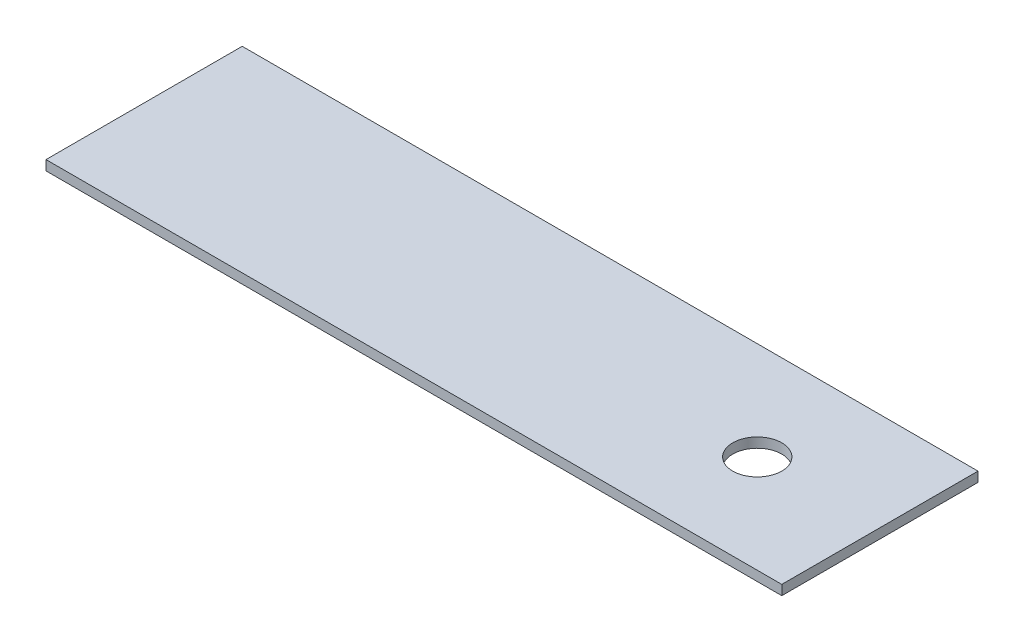
ISO-10303-21;
HEADER;
FILE_DESCRIPTION(('STEP AP214'),'2;1');
FILE_NAME('part.step','',(''),(''),'','','');
FILE_SCHEMA(('AUTOMOTIVE_DESIGN { 1 0 10303 214 1 1 1 1 }'));
ENDSEC;
DATA;
#1=APPLICATION_CONTEXT('core data for automotive mechanical design processes');
#2=APPLICATION_PROTOCOL_DEFINITION('international standard','automotive_design',2000,#1);
#3=PRODUCT_CONTEXT('',#1,'mechanical');
#4=PRODUCT('Part','Part','',(#3));
#5=PRODUCT_RELATED_PRODUCT_CATEGORY('part','',(#4));
#6=PRODUCT_DEFINITION_FORMATION('','',#4);
#7=PRODUCT_DEFINITION_CONTEXT('part definition',#1,'design');
#8=PRODUCT_DEFINITION('design','',#6,#7);
#9=PRODUCT_DEFINITION_SHAPE('','',#8);
#10=(LENGTH_UNIT() NAMED_UNIT(*) SI_UNIT(.MILLI.,.METRE.));
#11=(NAMED_UNIT(*) PLANE_ANGLE_UNIT() SI_UNIT($,.RADIAN.));
#12=(NAMED_UNIT(*) SI_UNIT($,.STERADIAN.) SOLID_ANGLE_UNIT());
#13=UNCERTAINTY_MEASURE_WITH_UNIT(LENGTH_MEASURE(1.E-05),#10,'distance_accuracy_value','');
#14=(GEOMETRIC_REPRESENTATION_CONTEXT(3) GLOBAL_UNCERTAINTY_ASSIGNED_CONTEXT((#13)) GLOBAL_UNIT_ASSIGNED_CONTEXT((#10,
#11,#12)) REPRESENTATION_CONTEXT('',''));
#15=CARTESIAN_POINT('',(0.,0.,0.));
#16=DIRECTION('',(0.,0.,1.));
#17=DIRECTION('',(1.,0.,0.));
#18=AXIS2_PLACEMENT_3D('',#15,#16,#17);
#19=CARTESIAN_POINT('',(0.,2.,0.));
#20=DIRECTION('',(0.,1.,0.));
#21=DIRECTION('',(0.,0.,1.));
#22=AXIS2_PLACEMENT_3D('',#19,#20,#21);
#23=PLANE('',#22);
#24=DIRECTION('',(0.,0.,1.));
#25=VECTOR('',#24,1.);
#26=CARTESIAN_POINT('',(-33.2855548608348,2.,-10.179562894333));
#27=LINE('',#26,#25);
#28=CARTESIAN_POINT('',(-33.2855548608348,2.,-10.179562894333));
#29=VERTEX_POINT('',#28);
#30=CARTESIAN_POINT('',(-33.2855548608348,2.,29.820437105667));
#31=VERTEX_POINT('',#30);
#32=EDGE_CURVE('E87',#29,#31,#27,.T.);
#33=ORIENTED_EDGE('',*,*,#32,.T.);
#34=DIRECTION('',(1.,0.,0.));
#35=VECTOR('',#34,1.);
#36=CARTESIAN_POINT('',(-33.2855548608348,2.,29.820437105667));
#37=LINE('',#36,#35);
#38=CARTESIAN_POINT('',(116.714445139165,2.,29.820437105667));
#39=VERTEX_POINT('',#38);
#40=EDGE_CURVE('E82',#31,#39,#37,.T.);
#41=ORIENTED_EDGE('',*,*,#40,.T.);
#42=DIRECTION('',(0.,0.,-1.));
#43=VECTOR('',#42,1.);
#44=CARTESIAN_POINT('',(116.714445139165,2.,-10.179562894333));
#45=LINE('',#44,#43);
#46=CARTESIAN_POINT('',(116.714445139165,2.,-10.179562894333));
#47=VERTEX_POINT('',#46);
#48=EDGE_CURVE('E85',#39,#47,#45,.T.);
#49=ORIENTED_EDGE('',*,*,#48,.T.);
#50=DIRECTION('',(-1.,0.,0.));
#51=VECTOR('',#50,1.);
#52=CARTESIAN_POINT('',(-33.2855548608348,2.,-10.179562894333));
#53=LINE('',#52,#51);
#54=EDGE_CURVE('E52',#47,#29,#53,.T.);
#55=ORIENTED_EDGE('',*,*,#54,.T.);
#56=EDGE_LOOP('',(#33,#41,#49,#55));
#57=FACE_BOUND('',#56,.T.);
#58=CARTESIAN_POINT('',(91.7144451391652,2.,9.82043710566703));
#59=DIRECTION('',(0.,1.,0.));
#60=DIRECTION('',(0.,0.,1.));
#61=AXIS2_PLACEMENT_3D('',#58,#59,#60);
#62=CIRCLE('',#61,5.);
#63=CARTESIAN_POINT('',(91.7144451391652,2.,14.820437105667));
#64=VERTEX_POINT('',#63);
#65=EDGE_CURVE('E102',#64,#64,#62,.T.);
#66=ORIENTED_EDGE('',*,*,#65,.F.);
#67=EDGE_LOOP('',(#66));
#68=FACE_BOUND('',#67,.T.);
#69=ADVANCED_FACE('F35',(#57,#68),#23,.T.);
#70=CARTESIAN_POINT('',(0.,0.,0.));
#71=DIRECTION('',(0.,1.,0.));
#72=DIRECTION('',(0.,0.,1.));
#73=AXIS2_PLACEMENT_3D('',#70,#71,#72);
#74=PLANE('',#73);
#75=DIRECTION('',(0.,0.,1.));
#76=VECTOR('',#75,1.);
#77=CARTESIAN_POINT('',(-33.2855548608348,0.,-10.179562894333));
#78=LINE('',#77,#76);
#79=CARTESIAN_POINT('',(-33.2855548608348,0.,-10.179562894333));
#80=VERTEX_POINT('',#79);
#81=CARTESIAN_POINT('',(-33.2855548608348,0.,29.820437105667));
#82=VERTEX_POINT('',#81);
#83=EDGE_CURVE('E99',#80,#82,#78,.T.);
#84=ORIENTED_EDGE('',*,*,#83,.F.);
#85=DIRECTION('',(-1.,0.,0.));
#86=VECTOR('',#85,1.);
#87=CARTESIAN_POINT('',(-33.2855548608348,0.,-10.179562894333));
#88=LINE('',#87,#86);
#89=CARTESIAN_POINT('',(116.714445139165,0.,-10.179562894333));
#90=VERTEX_POINT('',#89);
#91=EDGE_CURVE('E75',#90,#80,#88,.T.);
#92=ORIENTED_EDGE('',*,*,#91,.F.);
#93=DIRECTION('',(0.,0.,-1.));
#94=VECTOR('',#93,1.);
#95=CARTESIAN_POINT('',(116.714445139165,0.,-10.179562894333));
#96=LINE('',#95,#94);
#97=CARTESIAN_POINT('',(116.714445139165,0.,29.820437105667));
#98=VERTEX_POINT('',#97);
#99=EDGE_CURVE('E69',#98,#90,#96,.T.);
#100=ORIENTED_EDGE('',*,*,#99,.F.);
#101=DIRECTION('',(1.,0.,0.));
#102=VECTOR('',#101,1.);
#103=CARTESIAN_POINT('',(-33.2855548608348,0.,29.820437105667));
#104=LINE('',#103,#102);
#105=EDGE_CURVE('E91',#82,#98,#104,.T.);
#106=ORIENTED_EDGE('',*,*,#105,.F.);
#107=EDGE_LOOP('',(#84,#92,#100,#106));
#108=FACE_BOUND('',#107,.T.);
#109=CARTESIAN_POINT('',(91.7144451391652,0.,9.82043710566703));
#110=DIRECTION('',(0.,1.,0.));
#111=DIRECTION('',(0.,0.,1.));
#112=AXIS2_PLACEMENT_3D('',#109,#110,#111);
#113=CIRCLE('',#112,5.);
#114=CARTESIAN_POINT('',(91.7144451391652,0.,14.820437105667));
#115=VERTEX_POINT('',#114);
#116=EDGE_CURVE('E114',#115,#115,#113,.T.);
#117=ORIENTED_EDGE('',*,*,#116,.T.);
#118=EDGE_LOOP('',(#117));
#119=FACE_BOUND('',#118,.T.);
#120=ADVANCED_FACE('F110',(#108,#119),#74,.F.);
#121=CARTESIAN_POINT('',(-33.2855548608348,2.,-10.179562894333));
#122=DIRECTION('',(1.,0.,0.));
#123=DIRECTION('',(0.,0.,-1.));
#124=AXIS2_PLACEMENT_3D('',#121,#122,#123);
#125=PLANE('',#124);
#126=ORIENTED_EDGE('',*,*,#83,.T.);
#127=DIRECTION('',(0.,-1.,0.));
#128=VECTOR('',#127,1.);
#129=CARTESIAN_POINT('',(-33.2855548608348,2.,29.820437105667));
#130=LINE('',#129,#128);
#131=EDGE_CURVE('E11',#31,#82,#130,.T.);
#132=ORIENTED_EDGE('',*,*,#131,.F.);
#133=ORIENTED_EDGE('',*,*,#32,.F.);
#134=DIRECTION('',(0.,-1.,0.));
#135=VECTOR('',#134,1.);
#136=CARTESIAN_POINT('',(-33.2855548608348,2.,-10.179562894333));
#137=LINE('',#136,#135);
#138=EDGE_CURVE('E95',#29,#80,#137,.T.);
#139=ORIENTED_EDGE('',*,*,#138,.T.);
#140=EDGE_LOOP('',(#126,#132,#133,#139));
#141=FACE_BOUND('',#140,.T.);
#142=ADVANCED_FACE('F37',(#141),#125,.F.);
#143=CARTESIAN_POINT('',(-33.2855548608348,2.,29.820437105667));
#144=DIRECTION('',(0.,0.,-1.));
#145=DIRECTION('',(-1.,0.,0.));
#146=AXIS2_PLACEMENT_3D('',#143,#144,#145);
#147=PLANE('',#146);
#148=ORIENTED_EDGE('',*,*,#105,.T.);
#149=DIRECTION('',(0.,-1.,0.));
#150=VECTOR('',#149,1.);
#151=CARTESIAN_POINT('',(116.714445139165,2.,29.820437105667));
#152=LINE('',#151,#150);
#153=EDGE_CURVE('E44',#39,#98,#152,.T.);
#154=ORIENTED_EDGE('',*,*,#153,.F.);
#155=ORIENTED_EDGE('',*,*,#40,.F.);
#156=ORIENTED_EDGE('',*,*,#131,.T.);
#157=EDGE_LOOP('',(#148,#154,#155,#156));
#158=FACE_BOUND('',#157,.T.);
#159=ADVANCED_FACE('F90',(#158),#147,.F.);
#160=CARTESIAN_POINT('',(116.714445139165,2.,-10.179562894333));
#161=DIRECTION('',(-1.,0.,0.));
#162=DIRECTION('',(0.,0.,1.));
#163=AXIS2_PLACEMENT_3D('',#160,#161,#162);
#164=PLANE('',#163);
#165=ORIENTED_EDGE('',*,*,#99,.T.);
#166=DIRECTION('',(0.,-1.,0.));
#167=VECTOR('',#166,1.);
#168=CARTESIAN_POINT('',(116.714445139165,2.,-10.179562894333));
#169=LINE('',#168,#167);
#170=EDGE_CURVE('E92',#47,#90,#169,.T.);
#171=ORIENTED_EDGE('',*,*,#170,.F.);
#172=ORIENTED_EDGE('',*,*,#48,.F.);
#173=ORIENTED_EDGE('',*,*,#153,.T.);
#174=EDGE_LOOP('',(#165,#171,#172,#173));
#175=FACE_BOUND('',#174,.T.);
#176=ADVANCED_FACE('F93',(#175),#164,.F.);
#177=CARTESIAN_POINT('',(-33.2855548608348,2.,-10.179562894333));
#178=DIRECTION('',(0.,0.,1.));
#179=DIRECTION('',(1.,0.,0.));
#180=AXIS2_PLACEMENT_3D('',#177,#178,#179);
#181=PLANE('',#180);
#182=ORIENTED_EDGE('',*,*,#91,.T.);
#183=ORIENTED_EDGE('',*,*,#138,.F.);
#184=ORIENTED_EDGE('',*,*,#54,.F.);
#185=ORIENTED_EDGE('',*,*,#170,.T.);
#186=EDGE_LOOP('',(#182,#183,#184,#185));
#187=FACE_BOUND('',#186,.T.);
#188=ADVANCED_FACE('F107',(#187),#181,.F.);
#189=CARTESIAN_POINT('',(91.7144451391652,2.,9.82043710566703));
#190=DIRECTION('',(0.,-1.,0.));
#191=DIRECTION('',(0.,0.,-1.));
#192=AXIS2_PLACEMENT_3D('',#189,#190,#191);
#193=CYLINDRICAL_SURFACE('',#192,5.);
#194=ORIENTED_EDGE('',*,*,#65,.T.);
#195=EDGE_LOOP('',(#194));
#196=FACE_BOUND('',#195,.T.);
#197=ORIENTED_EDGE('',*,*,#116,.F.);
#198=EDGE_LOOP('',(#197));
#199=FACE_BOUND('',#198,.T.);
#200=ADVANCED_FACE('F120',(#196,#199),#193,.F.);
#201=CLOSED_SHELL('',(#69,#120,#142,#159,#176,#188,#200));
#202=MANIFOLD_SOLID_BREP('B2',#201);
#203=ADVANCED_BREP_SHAPE_REPRESENTATION('',(#18,#202),#14);
#204=SHAPE_DEFINITION_REPRESENTATION(#9,#203);
ENDSEC;
END-ISO-10303-21;
